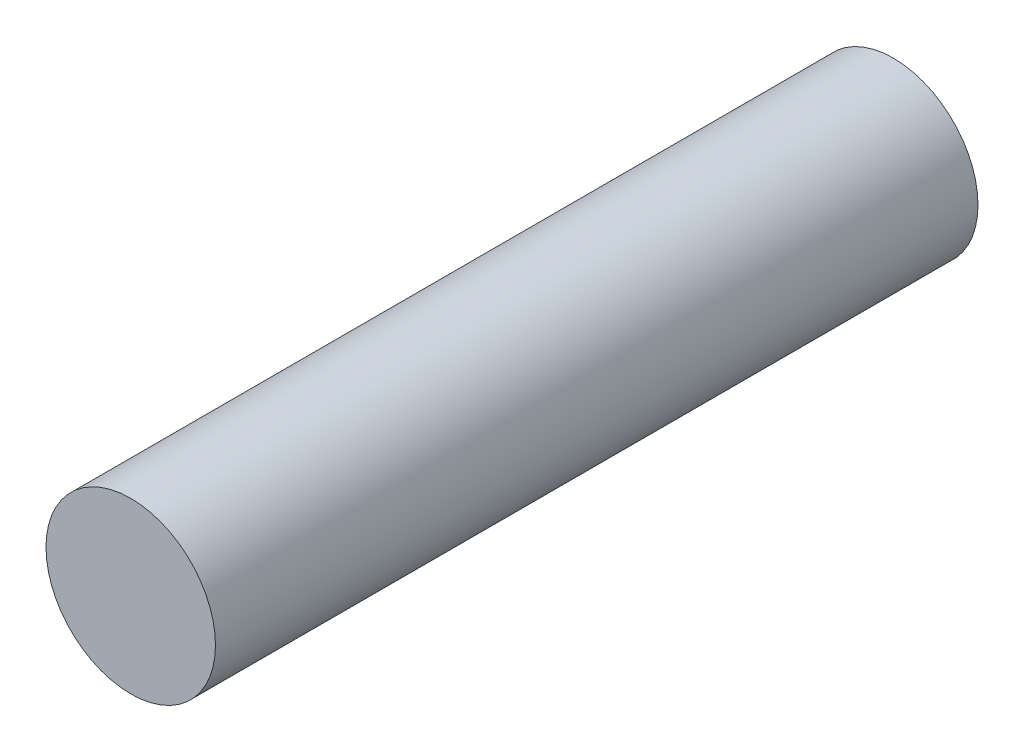
ISO-10303-21;
HEADER;
FILE_DESCRIPTION(('STEP AP214'),'2;1');
FILE_NAME('part.step','',(''),(''),'','','');
FILE_SCHEMA(('AUTOMOTIVE_DESIGN { 1 0 10303 214 1 1 1 1 }'));
ENDSEC;
DATA;
#1=APPLICATION_CONTEXT('core data for automotive mechanical design processes');
#2=APPLICATION_PROTOCOL_DEFINITION('international standard','automotive_design',2000,#1);
#3=PRODUCT_CONTEXT('',#1,'mechanical');
#4=PRODUCT('Part','Part','',(#3));
#5=PRODUCT_RELATED_PRODUCT_CATEGORY('part','',(#4));
#6=PRODUCT_DEFINITION_FORMATION('','',#4);
#7=PRODUCT_DEFINITION_CONTEXT('part definition',#1,'design');
#8=PRODUCT_DEFINITION('design','',#6,#7);
#9=PRODUCT_DEFINITION_SHAPE('','',#8);
#10=(LENGTH_UNIT() NAMED_UNIT(*) SI_UNIT(.MILLI.,.METRE.));
#11=(NAMED_UNIT(*) PLANE_ANGLE_UNIT() SI_UNIT($,.RADIAN.));
#12=(NAMED_UNIT(*) SI_UNIT($,.STERADIAN.) SOLID_ANGLE_UNIT());
#13=UNCERTAINTY_MEASURE_WITH_UNIT(LENGTH_MEASURE(1.E-05),#10,'distance_accuracy_value','');
#14=(GEOMETRIC_REPRESENTATION_CONTEXT(3) GLOBAL_UNCERTAINTY_ASSIGNED_CONTEXT((#13)) GLOBAL_UNIT_ASSIGNED_CONTEXT((#10,
#11,#12)) REPRESENTATION_CONTEXT('',''));
#15=CARTESIAN_POINT('',(0.,0.,0.));
#16=DIRECTION('',(0.,0.,1.));
#17=DIRECTION('',(1.,0.,0.));
#18=AXIS2_PLACEMENT_3D('',#15,#16,#17);
#19=CARTESIAN_POINT('',(0.,0.,27.));
#20=DIRECTION('',(0.,0.,-1.));
#21=DIRECTION('',(-1.,0.,0.));
#22=AXIS2_PLACEMENT_3D('',#19,#20,#21);
#23=CYLINDRICAL_SURFACE('',#22,3.);
#24=CARTESIAN_POINT('',(0.,0.,27.));
#25=DIRECTION('',(0.,0.,1.));
#26=DIRECTION('',(1.,0.,0.));
#27=AXIS2_PLACEMENT_3D('',#24,#25,#26);
#28=CIRCLE('',#27,3.);
#29=CARTESIAN_POINT('',(3.,0.,27.));
#30=VERTEX_POINT('',#29);
#31=EDGE_CURVE('E10',#30,#30,#28,.T.);
#32=ORIENTED_EDGE('',*,*,#31,.F.);
#33=EDGE_LOOP('',(#32));
#34=FACE_BOUND('',#33,.T.);
#35=CARTESIAN_POINT('',(0.,0.,0.));
#36=DIRECTION('',(0.,0.,1.));
#37=DIRECTION('',(1.,0.,0.));
#38=AXIS2_PLACEMENT_3D('',#35,#36,#37);
#39=CIRCLE('',#38,3.);
#40=CARTESIAN_POINT('',(3.,0.,0.));
#41=VERTEX_POINT('',#40);
#42=EDGE_CURVE('E35',#41,#41,#39,.T.);
#43=ORIENTED_EDGE('',*,*,#42,.T.);
#44=EDGE_LOOP('',(#43));
#45=FACE_BOUND('',#44,.T.);
#46=ADVANCED_FACE('F32',(#34,#45),#23,.T.);
#47=CARTESIAN_POINT('',(0.,0.,27.));
#48=DIRECTION('',(0.,0.,1.));
#49=DIRECTION('',(1.,0.,0.));
#50=AXIS2_PLACEMENT_3D('',#47,#48,#49);
#51=PLANE('',#50);
#52=ORIENTED_EDGE('',*,*,#31,.T.);
#53=EDGE_LOOP('',(#52));
#54=FACE_BOUND('',#53,.T.);
#55=ADVANCED_FACE('F47',(#54),#51,.T.);
#56=CARTESIAN_POINT('',(0.,0.,0.));
#57=DIRECTION('',(0.,0.,1.));
#58=DIRECTION('',(1.,0.,0.));
#59=AXIS2_PLACEMENT_3D('',#56,#57,#58);
#60=PLANE('',#59);
#61=ORIENTED_EDGE('',*,*,#42,.F.);
#62=EDGE_LOOP('',(#61));
#63=FACE_BOUND('',#62,.T.);
#64=ADVANCED_FACE('F45',(#63),#60,.F.);
#65=CLOSED_SHELL('',(#46,#55,#64));
#66=MANIFOLD_SOLID_BREP('B2',#65);
#67=ADVANCED_BREP_SHAPE_REPRESENTATION('',(#18,#66),#14);
#68=SHAPE_DEFINITION_REPRESENTATION(#9,#67);
ENDSEC;
END-ISO-10303-21;
